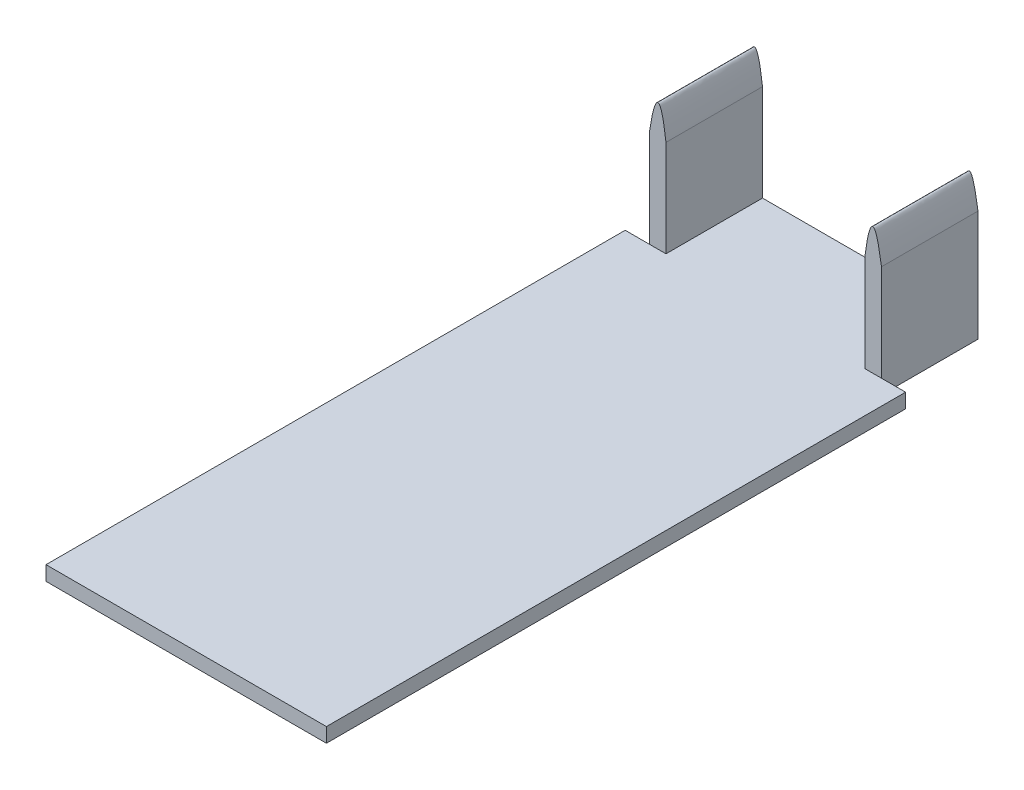
ISO-10303-21;
HEADER;
FILE_DESCRIPTION(('STEP AP214'),'2;1');
FILE_NAME('part.step','',(''),(''),'','','');
FILE_SCHEMA(('AUTOMOTIVE_DESIGN { 1 0 10303 214 1 1 1 1 }'));
ENDSEC;
DATA;
#1=APPLICATION_CONTEXT('core data for automotive mechanical design processes');
#2=APPLICATION_PROTOCOL_DEFINITION('international standard','automotive_design',2000,#1);
#3=PRODUCT_CONTEXT('',#1,'mechanical');
#4=PRODUCT('Part','Part','',(#3));
#5=PRODUCT_RELATED_PRODUCT_CATEGORY('part','',(#4));
#6=PRODUCT_DEFINITION_FORMATION('','',#4);
#7=PRODUCT_DEFINITION_CONTEXT('part definition',#1,'design');
#8=PRODUCT_DEFINITION('design','',#6,#7);
#9=PRODUCT_DEFINITION_SHAPE('','',#8);
#10=(LENGTH_UNIT() NAMED_UNIT(*) SI_UNIT(.MILLI.,.METRE.));
#11=(NAMED_UNIT(*) PLANE_ANGLE_UNIT() SI_UNIT($,.RADIAN.));
#12=(NAMED_UNIT(*) SI_UNIT($,.STERADIAN.) SOLID_ANGLE_UNIT());
#13=UNCERTAINTY_MEASURE_WITH_UNIT(LENGTH_MEASURE(1.E-05),#10,'distance_accuracy_value','');
#14=(GEOMETRIC_REPRESENTATION_CONTEXT(3) GLOBAL_UNCERTAINTY_ASSIGNED_CONTEXT((#13)) GLOBAL_UNIT_ASSIGNED_CONTEXT((#10,
#11,#12)) REPRESENTATION_CONTEXT('',''));
#15=CARTESIAN_POINT('',(0.,0.,0.));
#16=DIRECTION('',(0.,0.,1.));
#17=DIRECTION('',(1.,0.,0.));
#18=AXIS2_PLACEMENT_3D('',#15,#16,#17);
#19=CARTESIAN_POINT('',(22.2550587379189,71.1000540272372,20.));
#20=DIRECTION('',(0.,0.,-1.));
#21=DIRECTION('',(-1.,0.,0.));
#22=AXIS2_PLACEMENT_3D('',#19,#20,#21);
#23=PLANE('',#22);
#24=DIRECTION('',(0.,-1.,0.));
#25=VECTOR('',#24,1.);
#26=CARTESIAN_POINT('',(-24.05,64.8,20.));
#27=LINE('',#26,#25);
#28=CARTESIAN_POINT('',(-24.05,64.8,20.));
#29=VERTEX_POINT('',#28);
#30=CARTESIAN_POINT('',(-24.05,44.8,20.));
#31=VERTEX_POINT('',#30);
#32=EDGE_CURVE('E189',#29,#31,#27,.T.);
#33=ORIENTED_EDGE('',*,*,#32,.T.);
#34=DIRECTION('',(1.,0.,0.));
#35=VECTOR('',#34,1.);
#36=CARTESIAN_POINT('',(0.,44.8,20.));
#37=LINE('',#36,#35);
#38=CARTESIAN_POINT('',(-20.5946864211235,44.8,20.));
#39=VERTEX_POINT('',#38);
#40=EDGE_CURVE('E11',#31,#39,#37,.T.);
#41=ORIENTED_EDGE('',*,*,#40,.T.);
#42=DIRECTION('',(0.,-1.,0.));
#43=VECTOR('',#42,1.);
#44=CARTESIAN_POINT('',(-20.5946864211235,64.8,20.));
#45=LINE('',#44,#43);
#46=CARTESIAN_POINT('',(-20.5946864211235,64.8,20.));
#47=VERTEX_POINT('',#46);
#48=EDGE_CURVE('E253',#47,#39,#45,.T.);
#49=ORIENTED_EDGE('',*,*,#48,.F.);
#50=CARTESIAN_POINT('',(-24.05,64.8,20.));
#51=CARTESIAN_POINT('',(-22.1877742652761,77.4001080544743,20.));
#52=CARTESIAN_POINT('',(-20.5946864211235,64.8,20.));
#53=B_SPLINE_CURVE_WITH_KNOTS('',2,(#50,#51,#52),.UNSPECIFIED.,.F.,.F.,(3,3),(0.,1.),.UNSPECIFIED.);
#54=EDGE_CURVE('E281',#29,#47,#53,.T.);
#55=ORIENTED_EDGE('',*,*,#54,.F.);
#56=EDGE_LOOP('',(#33,#41,#49,#55));
#57=FACE_BOUND('',#56,.T.);
#58=ADVANCED_FACE('F41',(#57),#23,.F.);
#59=CARTESIAN_POINT('',(-24.05,64.8,20.));
#60=DIRECTION('',(1.,0.,0.));
#61=DIRECTION('',(0.,1.,0.));
#62=AXIS2_PLACEMENT_3D('',#59,#60,#61);
#63=PLANE('',#62);
#64=DIRECTION('',(0.,-1.,0.));
#65=VECTOR('',#64,1.);
#66=CARTESIAN_POINT('',(-24.05,64.8,0.));
#67=LINE('',#66,#65);
#68=CARTESIAN_POINT('',(-24.05,64.8,0.));
#69=VERTEX_POINT('',#68);
#70=CARTESIAN_POINT('',(-24.05,41.8,0.));
#71=VERTEX_POINT('',#70);
#72=EDGE_CURVE('E156',#69,#71,#67,.T.);
#73=ORIENTED_EDGE('',*,*,#72,.T.);
#74=DIRECTION('',(0.,0.,-1.));
#75=VECTOR('',#74,1.);
#76=CARTESIAN_POINT('',(-24.05,41.8,20.));
#77=LINE('',#76,#75);
#78=CARTESIAN_POINT('',(-24.05,41.8,20.));
#79=VERTEX_POINT('',#78);
#80=EDGE_CURVE('E45',#79,#71,#77,.T.);
#81=ORIENTED_EDGE('',*,*,#80,.F.);
#82=EDGE_CURVE('E193',#31,#79,#27,.T.);
#83=ORIENTED_EDGE('',*,*,#82,.F.);
#84=ORIENTED_EDGE('',*,*,#32,.F.);
#85=DIRECTION('',(0.,0.,-1.));
#86=VECTOR('',#85,1.);
#87=CARTESIAN_POINT('',(-24.05,64.8,20.));
#88=LINE('',#87,#86);
#89=EDGE_CURVE('E67',#29,#69,#88,.T.);
#90=ORIENTED_EDGE('',*,*,#89,.T.);
#91=EDGE_LOOP('',(#73,#81,#83,#84,#90));
#92=FACE_BOUND('',#91,.T.);
#93=ADVANCED_FACE('F43',(#92),#63,.F.);
#94=CARTESIAN_POINT('',(-24.05,41.8,20.));
#95=DIRECTION('',(0.,1.,0.));
#96=DIRECTION('',(-1.,0.,0.));
#97=AXIS2_PLACEMENT_3D('',#94,#95,#96);
#98=PLANE('',#97);
#99=DIRECTION('',(1.,0.,0.));
#100=VECTOR('',#99,1.);
#101=CARTESIAN_POINT('',(-24.05,41.8,0.));
#102=LINE('',#101,#100);
#103=CARTESIAN_POINT('',(24.05,41.8,0.));
#104=VERTEX_POINT('',#103);
#105=EDGE_CURVE('E272',#71,#104,#102,.T.);
#106=ORIENTED_EDGE('',*,*,#105,.T.);
#107=DIRECTION('',(0.,0.,-1.));
#108=VECTOR('',#107,1.);
#109=CARTESIAN_POINT('',(24.05,41.8,20.));
#110=LINE('',#109,#108);
#111=CARTESIAN_POINT('',(24.05,41.8,20.));
#112=VERTEX_POINT('',#111);
#113=EDGE_CURVE('E267',#112,#104,#110,.T.);
#114=ORIENTED_EDGE('',*,*,#113,.F.);
#115=DIRECTION('',(1.,0.,0.));
#116=VECTOR('',#115,1.);
#117=CARTESIAN_POINT('',(0.,41.8,20.));
#118=LINE('',#117,#116);
#119=CARTESIAN_POINT('',(29.05,41.8,20.));
#120=VERTEX_POINT('',#119);
#121=EDGE_CURVE('E178',#112,#120,#118,.T.);
#122=ORIENTED_EDGE('',*,*,#121,.T.);
#123=DIRECTION('',(0.,0.,-1.));
#124=VECTOR('',#123,1.);
#125=CARTESIAN_POINT('',(29.05,41.8,140.));
#126=LINE('',#125,#124);
#127=CARTESIAN_POINT('',(29.05,41.8,140.));
#128=VERTEX_POINT('',#127);
#129=EDGE_CURVE('E185',#128,#120,#126,.T.);
#130=ORIENTED_EDGE('',*,*,#129,.F.);
#131=DIRECTION('',(1.,0.,0.));
#132=VECTOR('',#131,1.);
#133=CARTESIAN_POINT('',(0.,41.8,140.));
#134=LINE('',#133,#132);
#135=CARTESIAN_POINT('',(-29.05,41.8,140.));
#136=VERTEX_POINT('',#135);
#137=EDGE_CURVE('E170',#136,#128,#134,.T.);
#138=ORIENTED_EDGE('',*,*,#137,.F.);
#139=DIRECTION('',(0.,0.,-1.));
#140=VECTOR('',#139,1.);
#141=CARTESIAN_POINT('',(-29.05,41.8,140.));
#142=LINE('',#141,#140);
#143=CARTESIAN_POINT('',(-29.05,41.8,20.));
#144=VERTEX_POINT('',#143);
#145=EDGE_CURVE('E157',#136,#144,#142,.T.);
#146=ORIENTED_EDGE('',*,*,#145,.T.);
#147=EDGE_CURVE('E179',#144,#79,#118,.T.);
#148=ORIENTED_EDGE('',*,*,#147,.T.);
#149=ORIENTED_EDGE('',*,*,#80,.T.);
#150=EDGE_LOOP('',(#106,#114,#122,#130,#138,#146,#148,#149));
#151=FACE_BOUND('',#150,.T.);
#152=ADVANCED_FACE('F216',(#151),#98,.F.);
#153=CARTESIAN_POINT('',(24.05,64.8,20.));
#154=DIRECTION('',(1.,0.,0.));
#155=DIRECTION('',(0.,1.,0.));
#156=AXIS2_PLACEMENT_3D('',#153,#154,#155);
#157=PLANE('',#156);
#158=DIRECTION('',(0.,-1.,0.));
#159=VECTOR('',#158,1.);
#160=CARTESIAN_POINT('',(24.05,64.8,0.));
#161=LINE('',#160,#159);
#162=CARTESIAN_POINT('',(24.05,64.8,0.));
#163=VERTEX_POINT('',#162);
#164=EDGE_CURVE('E278',#163,#104,#161,.T.);
#165=ORIENTED_EDGE('',*,*,#164,.F.);
#166=DIRECTION('',(0.,0.,-1.));
#167=VECTOR('',#166,1.);
#168=CARTESIAN_POINT('',(24.05,64.8,20.));
#169=LINE('',#168,#167);
#170=CARTESIAN_POINT('',(24.05,64.8,20.));
#171=VERTEX_POINT('',#170);
#172=EDGE_CURVE('E105',#171,#163,#169,.T.);
#173=ORIENTED_EDGE('',*,*,#172,.F.);
#174=DIRECTION('',(0.,-1.,0.));
#175=VECTOR('',#174,1.);
#176=CARTESIAN_POINT('',(24.05,64.8,20.));
#177=LINE('',#176,#175);
#178=CARTESIAN_POINT('',(24.05,44.8,20.));
#179=VERTEX_POINT('',#178);
#180=EDGE_CURVE('E194',#171,#179,#177,.T.);
#181=ORIENTED_EDGE('',*,*,#180,.T.);
#182=EDGE_CURVE('E192',#179,#112,#177,.T.);
#183=ORIENTED_EDGE('',*,*,#182,.T.);
#184=ORIENTED_EDGE('',*,*,#113,.T.);
#185=EDGE_LOOP('',(#165,#173,#181,#183,#184));
#186=FACE_BOUND('',#185,.T.);
#187=ADVANCED_FACE('F212',(#186),#157,.T.);
#188=CARTESIAN_POINT('',(24.05,64.8,20.));
#189=CARTESIAN_POINT('',(22.1877742652761,77.4001080544743,20.));
#190=CARTESIAN_POINT('',(20.5946864211235,64.8,20.));
#191=B_SPLINE_CURVE_WITH_KNOTS('',2,(#188,#189,#190),.UNSPECIFIED.,.F.,.F.,(3,3),(0.,1.),.UNSPECIFIED.);
#192=DIRECTION('',(0.,0.,-1.));
#193=VECTOR('',#192,1.);
#194=SURFACE_OF_LINEAR_EXTRUSION('',#191,#193);
#195=CARTESIAN_POINT('',(24.05,64.8,0.));
#196=CARTESIAN_POINT('',(22.1877742652761,77.4001080544743,0.));
#197=CARTESIAN_POINT('',(20.5946864211235,64.8,0.));
#198=B_SPLINE_CURVE_WITH_KNOTS('',2,(#195,#196,#197),.UNSPECIFIED.,.F.,.F.,(3,3),(0.,1.),.UNSPECIFIED.);
#199=CARTESIAN_POINT('',(20.5946864211235,64.8,0.));
#200=VERTEX_POINT('',#199);
#201=EDGE_CURVE('E287',#163,#200,#198,.T.);
#202=ORIENTED_EDGE('',*,*,#201,.T.);
#203=DIRECTION('',(0.,0.,-1.));
#204=VECTOR('',#203,1.);
#205=CARTESIAN_POINT('',(20.5946864211235,64.8,20.));
#206=LINE('',#205,#204);
#207=CARTESIAN_POINT('',(20.5946864211235,64.8,20.));
#208=VERTEX_POINT('',#207);
#209=EDGE_CURVE('E259',#208,#200,#206,.T.);
#210=ORIENTED_EDGE('',*,*,#209,.F.);
#211=EDGE_CURVE('E196',#171,#208,#191,.T.);
#212=ORIENTED_EDGE('',*,*,#211,.F.);
#213=ORIENTED_EDGE('',*,*,#172,.T.);
#214=EDGE_LOOP('',(#202,#210,#212,#213));
#215=FACE_BOUND('',#214,.T.);
#216=ADVANCED_FACE('F207',(#215),#194,.F.);
#217=CARTESIAN_POINT('',(20.5946864211236,64.8,20.));
#218=DIRECTION('',(1.,0.,0.));
#219=DIRECTION('',(0.,1.,0.));
#220=AXIS2_PLACEMENT_3D('',#217,#218,#219);
#221=PLANE('',#220);
#222=DIRECTION('',(0.,-1.,0.));
#223=VECTOR('',#222,1.);
#224=CARTESIAN_POINT('',(20.5946864211236,64.8,0.));
#225=LINE('',#224,#223);
#226=CARTESIAN_POINT('',(20.5946864211236,44.8,0.));
#227=VERTEX_POINT('',#226);
#228=EDGE_CURVE('E257',#200,#227,#225,.T.);
#229=ORIENTED_EDGE('',*,*,#228,.T.);
#230=DIRECTION('',(0.,0.,-1.));
#231=VECTOR('',#230,1.);
#232=CARTESIAN_POINT('',(20.5946864211236,44.8,20.));
#233=LINE('',#232,#231);
#234=CARTESIAN_POINT('',(20.5946864211235,44.8,20.));
#235=VERTEX_POINT('',#234);
#236=EDGE_CURVE('E255',#235,#227,#233,.T.);
#237=ORIENTED_EDGE('',*,*,#236,.F.);
#238=DIRECTION('',(0.,-1.,0.));
#239=VECTOR('',#238,1.);
#240=CARTESIAN_POINT('',(20.5946864211236,64.8,20.));
#241=LINE('',#240,#239);
#242=EDGE_CURVE('E201',#208,#235,#241,.T.);
#243=ORIENTED_EDGE('',*,*,#242,.F.);
#244=ORIENTED_EDGE('',*,*,#209,.T.);
#245=EDGE_LOOP('',(#229,#237,#243,#244));
#246=FACE_BOUND('',#245,.T.);
#247=ADVANCED_FACE('F211',(#246),#221,.F.);
#248=CARTESIAN_POINT('',(-20.5946864211235,44.8,20.));
#249=DIRECTION('',(0.,1.,0.));
#250=DIRECTION('',(-1.,0.,0.));
#251=AXIS2_PLACEMENT_3D('',#248,#249,#250);
#252=PLANE('',#251);
#253=DIRECTION('',(1.,0.,0.));
#254=VECTOR('',#253,1.);
#255=CARTESIAN_POINT('',(-20.5946864211235,44.8,0.));
#256=LINE('',#255,#254);
#257=CARTESIAN_POINT('',(-20.5946864211235,44.8,0.));
#258=VERTEX_POINT('',#257);
#259=EDGE_CURVE('E295',#258,#227,#256,.T.);
#260=ORIENTED_EDGE('',*,*,#259,.F.);
#261=DIRECTION('',(0.,0.,-1.));
#262=VECTOR('',#261,1.);
#263=CARTESIAN_POINT('',(-20.5946864211235,44.8,20.));
#264=LINE('',#263,#262);
#265=EDGE_CURVE('E260',#39,#258,#264,.T.);
#266=ORIENTED_EDGE('',*,*,#265,.F.);
#267=ORIENTED_EDGE('',*,*,#40,.F.);
#268=CARTESIAN_POINT('',(-29.05,44.8,20.));
#269=VERTEX_POINT('',#268);
#270=EDGE_CURVE('E151',#269,#31,#37,.T.);
#271=ORIENTED_EDGE('',*,*,#270,.F.);
#272=DIRECTION('',(0.,0.,-1.));
#273=VECTOR('',#272,1.);
#274=CARTESIAN_POINT('',(-29.05,44.8,140.));
#275=LINE('',#274,#273);
#276=CARTESIAN_POINT('',(-29.05,44.8,140.));
#277=VERTEX_POINT('',#276);
#278=EDGE_CURVE('E145',#277,#269,#275,.T.);
#279=ORIENTED_EDGE('',*,*,#278,.F.);
#280=DIRECTION('',(1.,0.,0.));
#281=VECTOR('',#280,1.);
#282=CARTESIAN_POINT('',(0.,44.8,140.));
#283=LINE('',#282,#281);
#284=CARTESIAN_POINT('',(29.05,44.8,140.));
#285=VERTEX_POINT('',#284);
#286=EDGE_CURVE('E149',#277,#285,#283,.T.);
#287=ORIENTED_EDGE('',*,*,#286,.T.);
#288=DIRECTION('',(0.,0.,-1.));
#289=VECTOR('',#288,1.);
#290=CARTESIAN_POINT('',(29.05,44.8,140.));
#291=LINE('',#290,#289);
#292=CARTESIAN_POINT('',(29.05,44.8,20.));
#293=VERTEX_POINT('',#292);
#294=EDGE_CURVE('E174',#285,#293,#291,.T.);
#295=ORIENTED_EDGE('',*,*,#294,.T.);
#296=EDGE_CURVE('E52',#179,#293,#37,.T.);
#297=ORIENTED_EDGE('',*,*,#296,.F.);
#298=EDGE_CURVE('E50',#235,#179,#37,.T.);
#299=ORIENTED_EDGE('',*,*,#298,.F.);
#300=ORIENTED_EDGE('',*,*,#236,.T.);
#301=EDGE_LOOP('',(#260,#266,#267,#271,#279,#287,#295,#297,#299,#300));
#302=FACE_BOUND('',#301,.T.);
#303=ADVANCED_FACE('F148',(#302),#252,.T.);
#304=CARTESIAN_POINT('',(-20.5946864211235,64.8,20.));
#305=DIRECTION('',(1.,0.,0.));
#306=DIRECTION('',(0.,1.,0.));
#307=AXIS2_PLACEMENT_3D('',#304,#305,#306);
#308=PLANE('',#307);
#309=DIRECTION('',(0.,-1.,0.));
#310=VECTOR('',#309,1.);
#311=CARTESIAN_POINT('',(-20.5946864211235,64.8,0.));
#312=LINE('',#311,#310);
#313=CARTESIAN_POINT('',(-20.5946864211235,64.8,0.));
#314=VERTEX_POINT('',#313);
#315=EDGE_CURVE('E297',#314,#258,#312,.T.);
#316=ORIENTED_EDGE('',*,*,#315,.F.);
#317=DIRECTION('',(0.,0.,-1.));
#318=VECTOR('',#317,1.);
#319=CARTESIAN_POINT('',(-20.5946864211235,64.8,20.));
#320=LINE('',#319,#318);
#321=EDGE_CURVE('E263',#47,#314,#320,.T.);
#322=ORIENTED_EDGE('',*,*,#321,.F.);
#323=ORIENTED_EDGE('',*,*,#48,.T.);
#324=ORIENTED_EDGE('',*,*,#265,.T.);
#325=EDGE_LOOP('',(#316,#322,#323,#324));
#326=FACE_BOUND('',#325,.T.);
#327=ADVANCED_FACE('F243',(#326),#308,.T.);
#328=DIRECTION('',(0.,0.,-1.));
#329=VECTOR('',#328,1.);
#330=SURFACE_OF_LINEAR_EXTRUSION('',#53,#329);
#331=CARTESIAN_POINT('',(-24.05,64.8,0.));
#332=CARTESIAN_POINT('',(-22.1877742652761,77.4001080544743,0.));
#333=CARTESIAN_POINT('',(-20.5946864211235,64.8,0.));
#334=B_SPLINE_CURVE_WITH_KNOTS('',2,(#331,#332,#333),.UNSPECIFIED.,.F.,.F.,(3,3),(0.,1.),.UNSPECIFIED.);
#335=EDGE_CURVE('E300',#69,#314,#334,.T.);
#336=ORIENTED_EDGE('',*,*,#335,.F.);
#337=ORIENTED_EDGE('',*,*,#89,.F.);
#338=ORIENTED_EDGE('',*,*,#54,.T.);
#339=ORIENTED_EDGE('',*,*,#321,.T.);
#340=EDGE_LOOP('',(#336,#337,#338,#339));
#341=FACE_BOUND('',#340,.T.);
#342=ADVANCED_FACE('F234',(#341),#330,.T.);
#343=ORIENTED_EDGE('',*,*,#242,.T.);
#344=ORIENTED_EDGE('',*,*,#298,.T.);
#345=ORIENTED_EDGE('',*,*,#180,.F.);
#346=ORIENTED_EDGE('',*,*,#211,.T.);
#347=EDGE_LOOP('',(#343,#344,#345,#346));
#348=FACE_BOUND('',#347,.T.);
#349=ADVANCED_FACE('F226',(#348),#23,.F.);
#350=CARTESIAN_POINT('',(22.2550587379189,71.1000540272372,0.));
#351=DIRECTION('',(0.,0.,-1.));
#352=DIRECTION('',(-1.,0.,0.));
#353=AXIS2_PLACEMENT_3D('',#350,#351,#352);
#354=PLANE('',#353);
#355=ORIENTED_EDGE('',*,*,#72,.F.);
#356=ORIENTED_EDGE('',*,*,#335,.T.);
#357=ORIENTED_EDGE('',*,*,#315,.T.);
#358=ORIENTED_EDGE('',*,*,#259,.T.);
#359=ORIENTED_EDGE('',*,*,#228,.F.);
#360=ORIENTED_EDGE('',*,*,#201,.F.);
#361=ORIENTED_EDGE('',*,*,#164,.T.);
#362=ORIENTED_EDGE('',*,*,#105,.F.);
#363=EDGE_LOOP('',(#355,#356,#357,#358,#359,#360,#361,#362));
#364=FACE_BOUND('',#363,.T.);
#365=ADVANCED_FACE('F233',(#364),#354,.T.);
#366=CARTESIAN_POINT('',(0.,0.,20.));
#367=DIRECTION('',(0.,0.,1.));
#368=DIRECTION('',(1.,0.,0.));
#369=AXIS2_PLACEMENT_3D('',#366,#367,#368);
#370=PLANE('',#369);
#371=ORIENTED_EDGE('',*,*,#270,.T.);
#372=ORIENTED_EDGE('',*,*,#82,.T.);
#373=ORIENTED_EDGE('',*,*,#147,.F.);
#374=DIRECTION('',(0.,1.,0.));
#375=VECTOR('',#374,1.);
#376=CARTESIAN_POINT('',(-29.05,0.,20.));
#377=LINE('',#376,#375);
#378=EDGE_CURVE('E176',#144,#269,#377,.T.);
#379=ORIENTED_EDGE('',*,*,#378,.T.);
#380=EDGE_LOOP('',(#371,#372,#373,#379));
#381=FACE_BOUND('',#380,.T.);
#382=ADVANCED_FACE('F240',(#381),#370,.F.);
#383=CARTESIAN_POINT('',(-29.05,0.,140.));
#384=DIRECTION('',(-1.,0.,0.));
#385=DIRECTION('',(0.,0.,1.));
#386=AXIS2_PLACEMENT_3D('',#383,#384,#385);
#387=PLANE('',#386);
#388=ORIENTED_EDGE('',*,*,#378,.F.);
#389=ORIENTED_EDGE('',*,*,#145,.F.);
#390=DIRECTION('',(0.,1.,0.));
#391=VECTOR('',#390,1.);
#392=CARTESIAN_POINT('',(-29.05,0.,140.));
#393=LINE('',#392,#391);
#394=EDGE_CURVE('E162',#136,#277,#393,.T.);
#395=ORIENTED_EDGE('',*,*,#394,.T.);
#396=ORIENTED_EDGE('',*,*,#278,.T.);
#397=EDGE_LOOP('',(#388,#389,#395,#396));
#398=FACE_BOUND('',#397,.T.);
#399=ADVANCED_FACE('F168',(#398),#387,.T.);
#400=CARTESIAN_POINT('',(29.05,0.,140.));
#401=DIRECTION('',(-1.,0.,0.));
#402=DIRECTION('',(0.,0.,1.));
#403=AXIS2_PLACEMENT_3D('',#400,#401,#402);
#404=PLANE('',#403);
#405=DIRECTION('',(0.,1.,0.));
#406=VECTOR('',#405,1.);
#407=CARTESIAN_POINT('',(29.05,0.,20.));
#408=LINE('',#407,#406);
#409=EDGE_CURVE('E166',#120,#293,#408,.T.);
#410=ORIENTED_EDGE('',*,*,#409,.T.);
#411=ORIENTED_EDGE('',*,*,#294,.F.);
#412=DIRECTION('',(0.,1.,0.));
#413=VECTOR('',#412,1.);
#414=CARTESIAN_POINT('',(29.05,0.,140.));
#415=LINE('',#414,#413);
#416=EDGE_CURVE('E164',#128,#285,#415,.T.);
#417=ORIENTED_EDGE('',*,*,#416,.F.);
#418=ORIENTED_EDGE('',*,*,#129,.T.);
#419=EDGE_LOOP('',(#410,#411,#417,#418));
#420=FACE_BOUND('',#419,.T.);
#421=ADVANCED_FACE('F320',(#420),#404,.F.);
#422=CARTESIAN_POINT('',(0.,0.,140.));
#423=DIRECTION('',(0.,0.,1.));
#424=DIRECTION('',(1.,0.,0.));
#425=AXIS2_PLACEMENT_3D('',#422,#423,#424);
#426=PLANE('',#425);
#427=ORIENTED_EDGE('',*,*,#286,.F.);
#428=ORIENTED_EDGE('',*,*,#394,.F.);
#429=ORIENTED_EDGE('',*,*,#137,.T.);
#430=ORIENTED_EDGE('',*,*,#416,.T.);
#431=EDGE_LOOP('',(#427,#428,#429,#430));
#432=FACE_BOUND('',#431,.T.);
#433=ADVANCED_FACE('F161',(#432),#426,.T.);
#434=ORIENTED_EDGE('',*,*,#182,.F.);
#435=ORIENTED_EDGE('',*,*,#296,.T.);
#436=ORIENTED_EDGE('',*,*,#409,.F.);
#437=ORIENTED_EDGE('',*,*,#121,.F.);
#438=EDGE_LOOP('',(#434,#435,#436,#437));
#439=FACE_BOUND('',#438,.T.);
#440=ADVANCED_FACE('F316',(#439),#370,.F.);
#441=CLOSED_SHELL('',(#58,#93,#152,#187,#216,#247,#303,#327,#342,#349,#365,#382,#399,#421,#433,#440));
#442=MANIFOLD_SOLID_BREP('B2',#441);
#443=ADVANCED_BREP_SHAPE_REPRESENTATION('',(#18,#442),#14);
#444=SHAPE_DEFINITION_REPRESENTATION(#9,#443);
ENDSEC;
END-ISO-10303-21;
